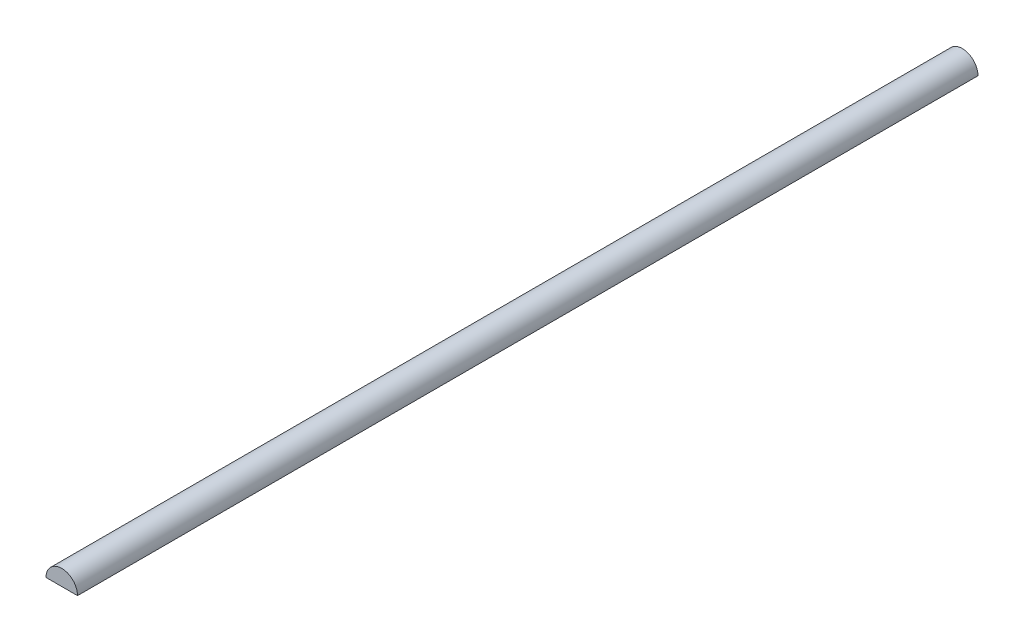
ISO-10303-21;
HEADER;
FILE_DESCRIPTION(('STEP AP214'),'2;1');
FILE_NAME('part.step','',(''),(''),'','','');
FILE_SCHEMA(('AUTOMOTIVE_DESIGN { 1 0 10303 214 1 1 1 1 }'));
ENDSEC;
DATA;
#1=APPLICATION_CONTEXT('core data for automotive mechanical design processes');
#2=APPLICATION_PROTOCOL_DEFINITION('international standard','automotive_design',2000,#1);
#3=PRODUCT_CONTEXT('',#1,'mechanical');
#4=PRODUCT('Part','Part','',(#3));
#5=PRODUCT_RELATED_PRODUCT_CATEGORY('part','',(#4));
#6=PRODUCT_DEFINITION_FORMATION('','',#4);
#7=PRODUCT_DEFINITION_CONTEXT('part definition',#1,'design');
#8=PRODUCT_DEFINITION('design','',#6,#7);
#9=PRODUCT_DEFINITION_SHAPE('','',#8);
#10=(LENGTH_UNIT() NAMED_UNIT(*) SI_UNIT(.MILLI.,.METRE.));
#11=(NAMED_UNIT(*) PLANE_ANGLE_UNIT() SI_UNIT($,.RADIAN.));
#12=(NAMED_UNIT(*) SI_UNIT($,.STERADIAN.) SOLID_ANGLE_UNIT());
#13=UNCERTAINTY_MEASURE_WITH_UNIT(LENGTH_MEASURE(1.E-05),#10,'distance_accuracy_value','');
#14=(GEOMETRIC_REPRESENTATION_CONTEXT(3) GLOBAL_UNCERTAINTY_ASSIGNED_CONTEXT((#13)) GLOBAL_UNIT_ASSIGNED_CONTEXT((#10,
#11,#12)) REPRESENTATION_CONTEXT('',''));
#15=CARTESIAN_POINT('',(0.,0.,0.));
#16=DIRECTION('',(0.,0.,1.));
#17=DIRECTION('',(1.,0.,0.));
#18=AXIS2_PLACEMENT_3D('',#15,#16,#17);
#19=CARTESIAN_POINT('',(0.,-5.56506766996506,-200.));
#20=DIRECTION('',(0.,0.,1.));
#21=DIRECTION('',(1.,0.,0.));
#22=AXIS2_PLACEMENT_3D('',#19,#20,#21);
#23=CYLINDRICAL_SURFACE('',#22,3.5);
#24=CARTESIAN_POINT('',(0.,-5.56506766996506,0.));
#25=DIRECTION('',(0.,0.,1.));
#26=DIRECTION('',(1.,0.,0.));
#27=AXIS2_PLACEMENT_3D('',#24,#25,#26);
#28=CIRCLE('',#27,3.5);
#29=CARTESIAN_POINT('',(3.5,-5.56506766996506,0.));
#30=VERTEX_POINT('',#29);
#31=CARTESIAN_POINT('',(-3.5,-5.56506766996506,0.));
#32=VERTEX_POINT('',#31);
#33=EDGE_CURVE('E61',#30,#32,#28,.T.);
#34=ORIENTED_EDGE('',*,*,#33,.F.);
#35=DIRECTION('',(0.,0.,1.));
#36=VECTOR('',#35,1.);
#37=CARTESIAN_POINT('',(3.5,-5.56506766996506,-200.));
#38=LINE('',#37,#36);
#39=CARTESIAN_POINT('',(3.5,-5.56506766996506,-200.));
#40=VERTEX_POINT('',#39);
#41=EDGE_CURVE('E11',#40,#30,#38,.T.);
#42=ORIENTED_EDGE('',*,*,#41,.F.);
#43=CARTESIAN_POINT('',(0.,-5.56506766996506,-200.));
#44=DIRECTION('',(0.,0.,1.));
#45=DIRECTION('',(1.,0.,0.));
#46=AXIS2_PLACEMENT_3D('',#43,#44,#45);
#47=CIRCLE('',#46,3.5);
#48=CARTESIAN_POINT('',(-3.5,-5.56506766996506,-200.));
#49=VERTEX_POINT('',#48);
#50=EDGE_CURVE('E65',#40,#49,#47,.T.);
#51=ORIENTED_EDGE('',*,*,#50,.T.);
#52=DIRECTION('',(0.,0.,1.));
#53=VECTOR('',#52,1.);
#54=CARTESIAN_POINT('',(-3.5,-5.56506766996506,-200.));
#55=LINE('',#54,#53);
#56=EDGE_CURVE('E35',#49,#32,#55,.T.);
#57=ORIENTED_EDGE('',*,*,#56,.T.);
#58=EDGE_LOOP('',(#34,#42,#51,#57));
#59=FACE_BOUND('',#58,.T.);
#60=ADVANCED_FACE('F32',(#59),#23,.T.);
#61=CARTESIAN_POINT('',(-3.5,-5.56506766996506,-200.));
#62=DIRECTION('',(0.,-1.,0.));
#63=DIRECTION('',(0.,0.,-1.));
#64=AXIS2_PLACEMENT_3D('',#61,#62,#63);
#65=PLANE('',#64);
#66=DIRECTION('',(1.,0.,0.));
#67=VECTOR('',#66,1.);
#68=CARTESIAN_POINT('',(-3.5,-5.56506766996506,0.));
#69=LINE('',#68,#67);
#70=EDGE_CURVE('E58',#32,#30,#69,.T.);
#71=ORIENTED_EDGE('',*,*,#70,.F.);
#72=ORIENTED_EDGE('',*,*,#56,.F.);
#73=DIRECTION('',(1.,0.,0.));
#74=VECTOR('',#73,1.);
#75=CARTESIAN_POINT('',(-3.5,-5.56506766996506,-200.));
#76=LINE('',#75,#74);
#77=EDGE_CURVE('E60',#49,#40,#76,.T.);
#78=ORIENTED_EDGE('',*,*,#77,.T.);
#79=ORIENTED_EDGE('',*,*,#41,.T.);
#80=EDGE_LOOP('',(#71,#72,#78,#79));
#81=FACE_BOUND('',#80,.T.);
#82=ADVANCED_FACE('F56',(#81),#65,.T.);
#83=CARTESIAN_POINT('',(0.,-5.56506766996506,-200.));
#84=DIRECTION('',(0.,0.,1.));
#85=DIRECTION('',(1.,0.,0.));
#86=AXIS2_PLACEMENT_3D('',#83,#84,#85);
#87=PLANE('',#86);
#88=ORIENTED_EDGE('',*,*,#50,.F.);
#89=ORIENTED_EDGE('',*,*,#77,.F.);
#90=EDGE_LOOP('',(#88,#89));
#91=FACE_BOUND('',#90,.T.);
#92=ADVANCED_FACE('F70',(#91),#87,.F.);
#93=CARTESIAN_POINT('',(0.,-5.56506766996506,0.));
#94=DIRECTION('',(0.,0.,1.));
#95=DIRECTION('',(1.,0.,0.));
#96=AXIS2_PLACEMENT_3D('',#93,#94,#95);
#97=PLANE('',#96);
#98=ORIENTED_EDGE('',*,*,#33,.T.);
#99=ORIENTED_EDGE('',*,*,#70,.T.);
#100=EDGE_LOOP('',(#98,#99));
#101=FACE_BOUND('',#100,.T.);
#102=ADVANCED_FACE('F64',(#101),#97,.T.);
#103=CLOSED_SHELL('',(#60,#82,#92,#102));
#104=MANIFOLD_SOLID_BREP('B2',#103);
#105=ADVANCED_BREP_SHAPE_REPRESENTATION('',(#18,#104),#14);
#106=SHAPE_DEFINITION_REPRESENTATION(#9,#105);
ENDSEC;
END-ISO-10303-21;
